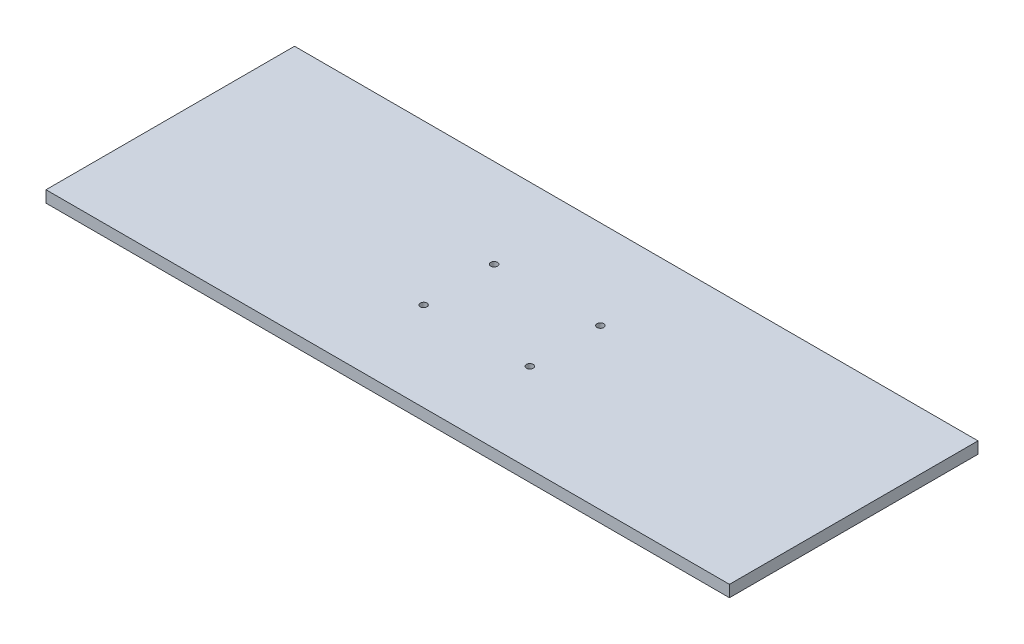
ISO-10303-21;
HEADER;
FILE_DESCRIPTION(('STEP AP214'),'2;1');
FILE_NAME('part.step','',(''),(''),'','','');
FILE_SCHEMA(('AUTOMOTIVE_DESIGN { 1 0 10303 214 1 1 1 1 }'));
ENDSEC;
DATA;
#1=APPLICATION_CONTEXT('core data for automotive mechanical design processes');
#2=APPLICATION_PROTOCOL_DEFINITION('international standard','automotive_design',2000,#1);
#3=PRODUCT_CONTEXT('',#1,'mechanical');
#4=PRODUCT('Part','Part','',(#3));
#5=PRODUCT_RELATED_PRODUCT_CATEGORY('part','',(#4));
#6=PRODUCT_DEFINITION_FORMATION('','',#4);
#7=PRODUCT_DEFINITION_CONTEXT('part definition',#1,'design');
#8=PRODUCT_DEFINITION('design','',#6,#7);
#9=PRODUCT_DEFINITION_SHAPE('','',#8);
#10=(LENGTH_UNIT() NAMED_UNIT(*) SI_UNIT(.MILLI.,.METRE.));
#11=(NAMED_UNIT(*) PLANE_ANGLE_UNIT() SI_UNIT($,.RADIAN.));
#12=(NAMED_UNIT(*) SI_UNIT($,.STERADIAN.) SOLID_ANGLE_UNIT());
#13=UNCERTAINTY_MEASURE_WITH_UNIT(LENGTH_MEASURE(1.E-05),#10,'distance_accuracy_value','');
#14=(GEOMETRIC_REPRESENTATION_CONTEXT(3) GLOBAL_UNCERTAINTY_ASSIGNED_CONTEXT((#13)) GLOBAL_UNIT_ASSIGNED_CONTEXT((#10,
#11,#12)) REPRESENTATION_CONTEXT('',''));
#15=CARTESIAN_POINT('',(0.,0.,0.));
#16=DIRECTION('',(0.,0.,1.));
#17=DIRECTION('',(1.,0.,0.));
#18=AXIS2_PLACEMENT_3D('',#15,#16,#17);
#19=CARTESIAN_POINT('',(0.,9.525,0.));
#20=DIRECTION('',(1.,0.,0.));
#21=DIRECTION('',(0.,0.,-1.));
#22=AXIS2_PLACEMENT_3D('',#19,#20,#21);
#23=PLANE('',#22);
#24=DIRECTION('',(0.,0.,1.));
#25=VECTOR('',#24,1.);
#26=CARTESIAN_POINT('',(0.,0.,0.));
#27=LINE('',#26,#25);
#28=CARTESIAN_POINT('',(0.,0.,-203.2));
#29=VERTEX_POINT('',#28);
#30=CARTESIAN_POINT('',(0.,0.,0.));
#31=VERTEX_POINT('',#30);
#32=EDGE_CURVE('E96',#29,#31,#27,.T.);
#33=ORIENTED_EDGE('',*,*,#32,.T.);
#34=DIRECTION('',(0.,-1.,0.));
#35=VECTOR('',#34,1.);
#36=CARTESIAN_POINT('',(0.,9.525,0.));
#37=LINE('',#36,#35);
#38=CARTESIAN_POINT('',(0.,9.525,0.));
#39=VERTEX_POINT('',#38);
#40=EDGE_CURVE('E11',#39,#31,#37,.T.);
#41=ORIENTED_EDGE('',*,*,#40,.F.);
#42=DIRECTION('',(0.,0.,1.));
#43=VECTOR('',#42,1.);
#44=CARTESIAN_POINT('',(0.,9.525,0.));
#45=LINE('',#44,#43);
#46=CARTESIAN_POINT('',(0.,9.525,-203.2));
#47=VERTEX_POINT('',#46);
#48=EDGE_CURVE('E84',#47,#39,#45,.T.);
#49=ORIENTED_EDGE('',*,*,#48,.F.);
#50=DIRECTION('',(0.,-1.,0.));
#51=VECTOR('',#50,1.);
#52=CARTESIAN_POINT('',(0.,9.525,-203.2));
#53=LINE('',#52,#51);
#54=EDGE_CURVE('E92',#47,#29,#53,.T.);
#55=ORIENTED_EDGE('',*,*,#54,.T.);
#56=EDGE_LOOP('',(#33,#41,#49,#55));
#57=FACE_BOUND('',#56,.T.);
#58=ADVANCED_FACE('F33',(#57),#23,.F.);
#59=CARTESIAN_POINT('',(0.,9.525,0.));
#60=DIRECTION('',(0.,0.,-1.));
#61=DIRECTION('',(-1.,0.,0.));
#62=AXIS2_PLACEMENT_3D('',#59,#60,#61);
#63=PLANE('',#62);
#64=DIRECTION('',(1.,0.,0.));
#65=VECTOR('',#64,1.);
#66=CARTESIAN_POINT('',(0.,0.,0.));
#67=LINE('',#66,#65);
#68=CARTESIAN_POINT('',(558.8,0.,0.));
#69=VERTEX_POINT('',#68);
#70=EDGE_CURVE('E88',#31,#69,#67,.T.);
#71=ORIENTED_EDGE('',*,*,#70,.T.);
#72=DIRECTION('',(0.,-1.,0.));
#73=VECTOR('',#72,1.);
#74=CARTESIAN_POINT('',(558.8,9.525,0.));
#75=LINE('',#74,#73);
#76=CARTESIAN_POINT('',(558.8,9.525,0.));
#77=VERTEX_POINT('',#76);
#78=EDGE_CURVE('E41',#77,#69,#75,.T.);
#79=ORIENTED_EDGE('',*,*,#78,.F.);
#80=DIRECTION('',(1.,0.,0.));
#81=VECTOR('',#80,1.);
#82=CARTESIAN_POINT('',(0.,9.525,0.));
#83=LINE('',#82,#81);
#84=EDGE_CURVE('E79',#39,#77,#83,.T.);
#85=ORIENTED_EDGE('',*,*,#84,.F.);
#86=ORIENTED_EDGE('',*,*,#40,.T.);
#87=EDGE_LOOP('',(#71,#79,#85,#86));
#88=FACE_BOUND('',#87,.T.);
#89=ADVANCED_FACE('F87',(#88),#63,.F.);
#90=CARTESIAN_POINT('',(558.8,9.525,0.));
#91=DIRECTION('',(-1.,0.,0.));
#92=DIRECTION('',(0.,0.,1.));
#93=AXIS2_PLACEMENT_3D('',#90,#91,#92);
#94=PLANE('',#93);
#95=DIRECTION('',(0.,0.,-1.));
#96=VECTOR('',#95,1.);
#97=CARTESIAN_POINT('',(558.8,0.,0.));
#98=LINE('',#97,#96);
#99=CARTESIAN_POINT('',(558.8,0.,-203.2));
#100=VERTEX_POINT('',#99);
#101=EDGE_CURVE('E66',#69,#100,#98,.T.);
#102=ORIENTED_EDGE('',*,*,#101,.T.);
#103=DIRECTION('',(0.,-1.,0.));
#104=VECTOR('',#103,1.);
#105=CARTESIAN_POINT('',(558.8,9.525,-203.2));
#106=LINE('',#105,#104);
#107=CARTESIAN_POINT('',(558.8,9.525,-203.2));
#108=VERTEX_POINT('',#107);
#109=EDGE_CURVE('E89',#108,#100,#106,.T.);
#110=ORIENTED_EDGE('',*,*,#109,.F.);
#111=DIRECTION('',(0.,0.,-1.));
#112=VECTOR('',#111,1.);
#113=CARTESIAN_POINT('',(558.8,9.525,0.));
#114=LINE('',#113,#112);
#115=EDGE_CURVE('E82',#77,#108,#114,.T.);
#116=ORIENTED_EDGE('',*,*,#115,.F.);
#117=ORIENTED_EDGE('',*,*,#78,.T.);
#118=EDGE_LOOP('',(#102,#110,#116,#117));
#119=FACE_BOUND('',#118,.T.);
#120=ADVANCED_FACE('F90',(#119),#94,.F.);
#121=CARTESIAN_POINT('',(0.,9.525,-203.2));
#122=DIRECTION('',(0.,0.,1.));
#123=DIRECTION('',(1.,0.,0.));
#124=AXIS2_PLACEMENT_3D('',#121,#122,#123);
#125=PLANE('',#124);
#126=DIRECTION('',(-1.,0.,0.));
#127=VECTOR('',#126,1.);
#128=CARTESIAN_POINT('',(0.,0.,-203.2));
#129=LINE('',#128,#127);
#130=EDGE_CURVE('E72',#100,#29,#129,.T.);
#131=ORIENTED_EDGE('',*,*,#130,.T.);
#132=ORIENTED_EDGE('',*,*,#54,.F.);
#133=DIRECTION('',(-1.,0.,0.));
#134=VECTOR('',#133,1.);
#135=CARTESIAN_POINT('',(0.,9.525,-203.2));
#136=LINE('',#135,#134);
#137=EDGE_CURVE('E49',#108,#47,#136,.T.);
#138=ORIENTED_EDGE('',*,*,#137,.F.);
#139=ORIENTED_EDGE('',*,*,#109,.T.);
#140=EDGE_LOOP('',(#131,#132,#138,#139));
#141=FACE_BOUND('',#140,.T.);
#142=ADVANCED_FACE('F104',(#141),#125,.F.);
#143=CARTESIAN_POINT('',(0.,9.525,0.));
#144=DIRECTION('',(0.,-1.,0.));
#145=DIRECTION('',(0.,0.,-1.));
#146=AXIS2_PLACEMENT_3D('',#143,#144,#145);
#147=PLANE('',#146);
#148=CARTESIAN_POINT('',(235.966,9.525,-130.429));
#149=DIRECTION('',(0.,1.,0.));
#150=DIRECTION('',(0.,0.,1.));
#151=AXIS2_PLACEMENT_3D('',#148,#149,#150);
#152=CIRCLE('',#151,2.74999999999997);
#153=CARTESIAN_POINT('',(235.966,9.525,-127.679));
#154=VERTEX_POINT('',#153);
#155=EDGE_CURVE('E130',#154,#154,#152,.T.);
#156=ORIENTED_EDGE('',*,*,#155,.F.);
#157=EDGE_LOOP('',(#156));
#158=FACE_BOUND('',#157,.T.);
#159=CARTESIAN_POINT('',(322.834,9.525,-130.429));
#160=DIRECTION('',(0.,1.,0.));
#161=DIRECTION('',(0.,0.,1.));
#162=AXIS2_PLACEMENT_3D('',#159,#160,#161);
#163=CIRCLE('',#162,2.74999999999997);
#164=CARTESIAN_POINT('',(322.834,9.525,-127.679));
#165=VERTEX_POINT('',#164);
#166=EDGE_CURVE('E124',#165,#165,#163,.T.);
#167=ORIENTED_EDGE('',*,*,#166,.F.);
#168=EDGE_LOOP('',(#167));
#169=FACE_BOUND('',#168,.T.);
#170=CARTESIAN_POINT('',(322.834,9.525,-72.771));
#171=DIRECTION('',(0.,1.,0.));
#172=DIRECTION('',(0.,0.,1.));
#173=AXIS2_PLACEMENT_3D('',#170,#171,#172);
#174=CIRCLE('',#173,2.74999999999997);
#175=CARTESIAN_POINT('',(322.834,9.525,-70.021));
#176=VERTEX_POINT('',#175);
#177=EDGE_CURVE('E118',#176,#176,#174,.T.);
#178=ORIENTED_EDGE('',*,*,#177,.F.);
#179=EDGE_LOOP('',(#178));
#180=FACE_BOUND('',#179,.T.);
#181=CARTESIAN_POINT('',(235.966,9.525,-72.771));
#182=DIRECTION('',(0.,1.,0.));
#183=DIRECTION('',(0.,0.,1.));
#184=AXIS2_PLACEMENT_3D('',#181,#182,#183);
#185=CIRCLE('',#184,2.75);
#186=CARTESIAN_POINT('',(235.966,9.525,-70.021));
#187=VERTEX_POINT('',#186);
#188=EDGE_CURVE('E112',#187,#187,#185,.T.);
#189=ORIENTED_EDGE('',*,*,#188,.F.);
#190=EDGE_LOOP('',(#189));
#191=FACE_BOUND('',#190,.T.);
#192=ORIENTED_EDGE('',*,*,#48,.T.);
#193=ORIENTED_EDGE('',*,*,#84,.T.);
#194=ORIENTED_EDGE('',*,*,#115,.T.);
#195=ORIENTED_EDGE('',*,*,#137,.T.);
#196=EDGE_LOOP('',(#192,#193,#194,#195));
#197=FACE_BOUND('',#196,.T.);
#198=ADVANCED_FACE('F80',(#158,#169,#180,#191,#197),#147,.F.);
#199=CARTESIAN_POINT('',(0.,0.,0.));
#200=DIRECTION('',(0.,-1.,0.));
#201=DIRECTION('',(0.,0.,-1.));
#202=AXIS2_PLACEMENT_3D('',#199,#200,#201);
#203=PLANE('',#202);
#204=CARTESIAN_POINT('',(235.966,0.,-130.429));
#205=DIRECTION('',(0.,1.,0.));
#206=DIRECTION('',(0.,0.,1.));
#207=AXIS2_PLACEMENT_3D('',#204,#205,#206);
#208=CIRCLE('',#207,2.75);
#209=CARTESIAN_POINT('',(235.966,0.,-127.679));
#210=VERTEX_POINT('',#209);
#211=EDGE_CURVE('E127',#210,#210,#208,.T.);
#212=ORIENTED_EDGE('',*,*,#211,.T.);
#213=EDGE_LOOP('',(#212));
#214=FACE_BOUND('',#213,.T.);
#215=CARTESIAN_POINT('',(322.834,0.,-130.429));
#216=DIRECTION('',(0.,1.,0.));
#217=DIRECTION('',(0.,0.,1.));
#218=AXIS2_PLACEMENT_3D('',#215,#216,#217);
#219=CIRCLE('',#218,2.74999999999997);
#220=CARTESIAN_POINT('',(322.834,0.,-127.679));
#221=VERTEX_POINT('',#220);
#222=EDGE_CURVE('E121',#221,#221,#219,.T.);
#223=ORIENTED_EDGE('',*,*,#222,.T.);
#224=EDGE_LOOP('',(#223));
#225=FACE_BOUND('',#224,.T.);
#226=CARTESIAN_POINT('',(322.834,0.,-72.771));
#227=DIRECTION('',(0.,1.,0.));
#228=DIRECTION('',(0.,0.,1.));
#229=AXIS2_PLACEMENT_3D('',#226,#227,#228);
#230=CIRCLE('',#229,2.74999999999997);
#231=CARTESIAN_POINT('',(322.834,0.,-70.021));
#232=VERTEX_POINT('',#231);
#233=EDGE_CURVE('E115',#232,#232,#230,.T.);
#234=ORIENTED_EDGE('',*,*,#233,.T.);
#235=EDGE_LOOP('',(#234));
#236=FACE_BOUND('',#235,.T.);
#237=CARTESIAN_POINT('',(235.966,0.,-72.771));
#238=DIRECTION('',(0.,1.,0.));
#239=DIRECTION('',(0.,0.,1.));
#240=AXIS2_PLACEMENT_3D('',#237,#238,#239);
#241=CIRCLE('',#240,2.75);
#242=CARTESIAN_POINT('',(235.966,0.,-70.021));
#243=VERTEX_POINT('',#242);
#244=EDGE_CURVE('E99',#243,#243,#241,.T.);
#245=ORIENTED_EDGE('',*,*,#244,.T.);
#246=EDGE_LOOP('',(#245));
#247=FACE_BOUND('',#246,.T.);
#248=ORIENTED_EDGE('',*,*,#32,.F.);
#249=ORIENTED_EDGE('',*,*,#130,.F.);
#250=ORIENTED_EDGE('',*,*,#101,.F.);
#251=ORIENTED_EDGE('',*,*,#70,.F.);
#252=EDGE_LOOP('',(#248,#249,#250,#251));
#253=FACE_BOUND('',#252,.T.);
#254=ADVANCED_FACE('F107',(#214,#225,#236,#247,#253),#203,.T.);
#255=CARTESIAN_POINT('',(235.966,9.525,-72.771));
#256=DIRECTION('',(0.,1.,0.));
#257=DIRECTION('',(0.,0.,1.));
#258=AXIS2_PLACEMENT_3D('',#255,#256,#257);
#259=CYLINDRICAL_SURFACE('',#258,2.75);
#260=ORIENTED_EDGE('',*,*,#244,.F.);
#261=EDGE_LOOP('',(#260));
#262=FACE_BOUND('',#261,.T.);
#263=ORIENTED_EDGE('',*,*,#188,.T.);
#264=EDGE_LOOP('',(#263));
#265=FACE_BOUND('',#264,.T.);
#266=ADVANCED_FACE('F145',(#262,#265),#259,.F.);
#267=CARTESIAN_POINT('',(322.834,9.525,-72.771));
#268=DIRECTION('',(0.,1.,0.));
#269=DIRECTION('',(0.,0.,1.));
#270=AXIS2_PLACEMENT_3D('',#267,#268,#269);
#271=CYLINDRICAL_SURFACE('',#270,2.74999999999997);
#272=ORIENTED_EDGE('',*,*,#233,.F.);
#273=EDGE_LOOP('',(#272));
#274=FACE_BOUND('',#273,.T.);
#275=ORIENTED_EDGE('',*,*,#177,.T.);
#276=EDGE_LOOP('',(#275));
#277=FACE_BOUND('',#276,.T.);
#278=ADVANCED_FACE('F147',(#274,#277),#271,.F.);
#279=CARTESIAN_POINT('',(322.834,9.525,-130.429));
#280=DIRECTION('',(0.,1.,0.));
#281=DIRECTION('',(0.,0.,1.));
#282=AXIS2_PLACEMENT_3D('',#279,#280,#281);
#283=CYLINDRICAL_SURFACE('',#282,2.74999999999997);
#284=ORIENTED_EDGE('',*,*,#222,.F.);
#285=EDGE_LOOP('',(#284));
#286=FACE_BOUND('',#285,.T.);
#287=ORIENTED_EDGE('',*,*,#166,.T.);
#288=EDGE_LOOP('',(#287));
#289=FACE_BOUND('',#288,.T.);
#290=ADVANCED_FACE('F154',(#286,#289),#283,.F.);
#291=CARTESIAN_POINT('',(235.966,9.525,-130.429));
#292=DIRECTION('',(0.,1.,0.));
#293=DIRECTION('',(0.,0.,1.));
#294=AXIS2_PLACEMENT_3D('',#291,#292,#293);
#295=CYLINDRICAL_SURFACE('',#294,2.74999999999999);
#296=ORIENTED_EDGE('',*,*,#211,.F.);
#297=EDGE_LOOP('',(#296));
#298=FACE_BOUND('',#297,.T.);
#299=ORIENTED_EDGE('',*,*,#155,.T.);
#300=EDGE_LOOP('',(#299));
#301=FACE_BOUND('',#300,.T.);
#302=ADVANCED_FACE('F134',(#298,#301),#295,.F.);
#303=CLOSED_SHELL('',(#58,#89,#120,#142,#198,#254,#266,#278,#290,#302));
#304=MANIFOLD_SOLID_BREP('B2',#303);
#305=ADVANCED_BREP_SHAPE_REPRESENTATION('',(#18,#304),#14);
#306=SHAPE_DEFINITION_REPRESENTATION(#9,#305);
ENDSEC;
END-ISO-10303-21;
